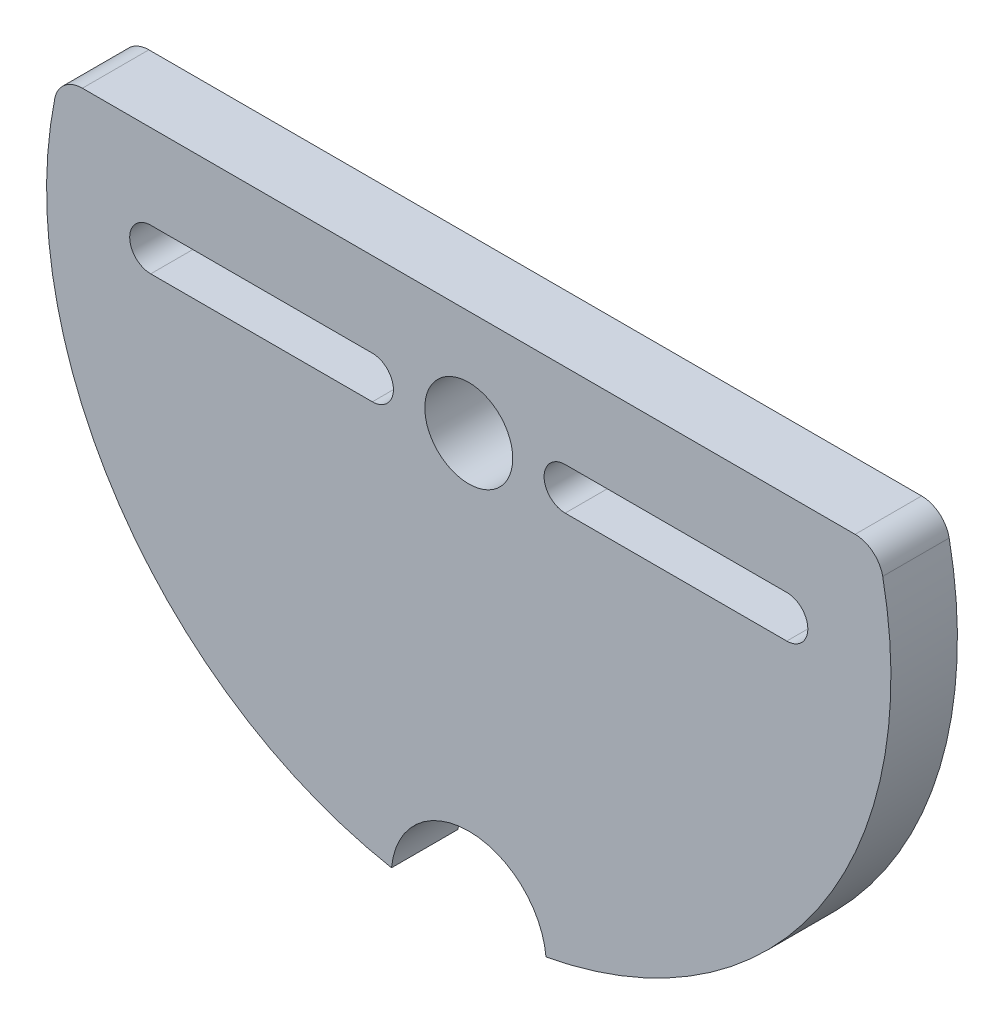
ISO-10303-21;
HEADER;
FILE_DESCRIPTION(('STEP AP214'),'2;1');
FILE_NAME('part.step','',(''),(''),'','','');
FILE_SCHEMA(('AUTOMOTIVE_DESIGN { 1 0 10303 214 1 1 1 1 }'));
ENDSEC;
DATA;
#1=APPLICATION_CONTEXT('core data for automotive mechanical design processes');
#2=APPLICATION_PROTOCOL_DEFINITION('international standard','automotive_design',2000,#1);
#3=PRODUCT_CONTEXT('',#1,'mechanical');
#4=PRODUCT('Part','Part','',(#3));
#5=PRODUCT_RELATED_PRODUCT_CATEGORY('part','',(#4));
#6=PRODUCT_DEFINITION_FORMATION('','',#4);
#7=PRODUCT_DEFINITION_CONTEXT('part definition',#1,'design');
#8=PRODUCT_DEFINITION('design','',#6,#7);
#9=PRODUCT_DEFINITION_SHAPE('','',#8);
#10=(LENGTH_UNIT() NAMED_UNIT(*) SI_UNIT(.MILLI.,.METRE.));
#11=(NAMED_UNIT(*) PLANE_ANGLE_UNIT() SI_UNIT($,.RADIAN.));
#12=(NAMED_UNIT(*) SI_UNIT($,.STERADIAN.) SOLID_ANGLE_UNIT());
#13=UNCERTAINTY_MEASURE_WITH_UNIT(LENGTH_MEASURE(1.E-05),#10,'distance_accuracy_value','');
#14=(GEOMETRIC_REPRESENTATION_CONTEXT(3) GLOBAL_UNCERTAINTY_ASSIGNED_CONTEXT((#13)) GLOBAL_UNIT_ASSIGNED_CONTEXT((#10,
#11,#12)) REPRESENTATION_CONTEXT('',''));
#15=CARTESIAN_POINT('',(0.,0.,0.));
#16=DIRECTION('',(0.,0.,1.));
#17=DIRECTION('',(1.,0.,0.));
#18=AXIS2_PLACEMENT_3D('',#15,#16,#17);
#19=CARTESIAN_POINT('',(0.,-19.05,3.));
#20=DIRECTION('',(0.,0.,-1.));
#21=DIRECTION('',(-1.,0.,0.));
#22=AXIS2_PLACEMENT_3D('',#19,#20,#21);
#23=CYLINDRICAL_SURFACE('',#22,3.5);
#24=CARTESIAN_POINT('',(0.,-19.05,0.));
#25=DIRECTION('',(0.,0.,-1.));
#26=DIRECTION('',(-1.,0.,0.));
#27=AXIS2_PLACEMENT_3D('',#24,#25,#26);
#28=CIRCLE('',#27,3.5);
#29=CARTESIAN_POINT('',(-3.48520062612727,-18.7284776902887,0.));
#30=VERTEX_POINT('',#29);
#31=CARTESIAN_POINT('',(3.48520062612727,-18.7284776902887,0.));
#32=VERTEX_POINT('',#31);
#33=EDGE_CURVE('E187',#30,#32,#28,.T.);
#34=ORIENTED_EDGE('',*,*,#33,.T.);
#35=DIRECTION('',(0.,0.,-1.));
#36=VECTOR('',#35,1.);
#37=CARTESIAN_POINT('',(3.48520062612727,-18.7284776902887,3.));
#38=LINE('',#37,#36);
#39=CARTESIAN_POINT('',(3.48520062612727,-18.7284776902887,3.));
#40=VERTEX_POINT('',#39);
#41=EDGE_CURVE('E11',#40,#32,#38,.T.);
#42=ORIENTED_EDGE('',*,*,#41,.F.);
#43=CARTESIAN_POINT('',(0.,-19.05,3.));
#44=DIRECTION('',(0.,0.,-1.));
#45=DIRECTION('',(-1.,0.,0.));
#46=AXIS2_PLACEMENT_3D('',#43,#44,#45);
#47=CIRCLE('',#46,3.5);
#48=CARTESIAN_POINT('',(-3.48520062612727,-18.7284776902887,3.));
#49=VERTEX_POINT('',#48);
#50=EDGE_CURVE('E242',#49,#40,#47,.T.);
#51=ORIENTED_EDGE('',*,*,#50,.F.);
#52=DIRECTION('',(0.,0.,-1.));
#53=VECTOR('',#52,1.);
#54=CARTESIAN_POINT('',(-3.48520062612727,-18.7284776902887,3.));
#55=LINE('',#54,#53);
#56=EDGE_CURVE('E262',#49,#30,#55,.T.);
#57=ORIENTED_EDGE('',*,*,#56,.T.);
#58=EDGE_LOOP('',(#34,#42,#51,#57));
#59=FACE_BOUND('',#58,.T.);
#60=ADVANCED_FACE('F39',(#59),#23,.F.);
#61=CARTESIAN_POINT('',(0.,0.,3.));
#62=DIRECTION('',(0.,0.,-1.));
#63=DIRECTION('',(-1.,0.,0.));
#64=AXIS2_PLACEMENT_3D('',#61,#62,#63);
#65=CYLINDRICAL_SURFACE('',#64,19.05);
#66=CARTESIAN_POINT('',(0.,0.,0.));
#67=DIRECTION('',(0.,0.,1.));
#68=DIRECTION('',(-1.,0.,0.));
#69=AXIS2_PLACEMENT_3D('',#66,#67,#68);
#70=CIRCLE('',#69,19.05);
#71=CARTESIAN_POINT('',(18.6788705034442,3.74196428571429,0.));
#72=VERTEX_POINT('',#71);
#73=EDGE_CURVE('E266',#32,#72,#70,.T.);
#74=ORIENTED_EDGE('',*,*,#73,.T.);
#75=DIRECTION('',(0.,0.,-1.));
#76=VECTOR('',#75,1.);
#77=CARTESIAN_POINT('',(18.6788705034442,3.74196428571429,3.));
#78=LINE('',#77,#76);
#79=CARTESIAN_POINT('',(18.6788705034442,3.74196428571429,3.));
#80=VERTEX_POINT('',#79);
#81=EDGE_CURVE('E47',#80,#72,#78,.T.);
#82=ORIENTED_EDGE('',*,*,#81,.F.);
#83=CARTESIAN_POINT('',(0.,0.,3.));
#84=DIRECTION('',(0.,0.,1.));
#85=DIRECTION('',(-1.,0.,0.));
#86=AXIS2_PLACEMENT_3D('',#83,#84,#85);
#87=CIRCLE('',#86,19.05);
#88=EDGE_CURVE('E246',#40,#80,#87,.T.);
#89=ORIENTED_EDGE('',*,*,#88,.F.);
#90=ORIENTED_EDGE('',*,*,#41,.T.);
#91=EDGE_LOOP('',(#74,#82,#89,#90));
#92=FACE_BOUND('',#91,.T.);
#93=ADVANCED_FACE('F322',(#92),#65,.T.);
#94=CARTESIAN_POINT('',(17.4336124698813,3.4925,3.));
#95=DIRECTION('',(0.,0.,-1.));
#96=DIRECTION('',(-1.,0.,0.));
#97=AXIS2_PLACEMENT_3D('',#94,#95,#96);
#98=CYLINDRICAL_SURFACE('',#97,1.27);
#99=CARTESIAN_POINT('',(17.4336124698813,3.4925,0.));
#100=DIRECTION('',(0.,0.,1.));
#101=DIRECTION('',(-1.,0.,0.));
#102=AXIS2_PLACEMENT_3D('',#99,#100,#101);
#103=CIRCLE('',#102,1.27);
#104=CARTESIAN_POINT('',(17.4336124698813,4.7625,0.));
#105=VERTEX_POINT('',#104);
#106=EDGE_CURVE('E269',#72,#105,#103,.T.);
#107=ORIENTED_EDGE('',*,*,#106,.T.);
#108=DIRECTION('',(0.,0.,-1.));
#109=VECTOR('',#108,1.);
#110=CARTESIAN_POINT('',(17.4336124698813,4.7625,3.));
#111=LINE('',#110,#109);
#112=CARTESIAN_POINT('',(17.4336124698813,4.7625,3.));
#113=VERTEX_POINT('',#112);
#114=EDGE_CURVE('E291',#113,#105,#111,.T.);
#115=ORIENTED_EDGE('',*,*,#114,.F.);
#116=CARTESIAN_POINT('',(17.4336124698813,3.4925,3.));
#117=DIRECTION('',(0.,0.,1.));
#118=DIRECTION('',(-1.,0.,0.));
#119=AXIS2_PLACEMENT_3D('',#116,#117,#118);
#120=CIRCLE('',#119,1.27);
#121=EDGE_CURVE('E250',#80,#113,#120,.T.);
#122=ORIENTED_EDGE('',*,*,#121,.F.);
#123=ORIENTED_EDGE('',*,*,#81,.T.);
#124=EDGE_LOOP('',(#107,#115,#122,#123));
#125=FACE_BOUND('',#124,.T.);
#126=ADVANCED_FACE('F300',(#125),#98,.T.);
#127=CARTESIAN_POINT('',(17.4336124698813,4.7625,3.));
#128=DIRECTION('',(0.,-1.,0.));
#129=DIRECTION('',(1.,0.,0.));
#130=AXIS2_PLACEMENT_3D('',#127,#128,#129);
#131=PLANE('',#130);
#132=DIRECTION('',(-1.,0.,0.));
#133=VECTOR('',#132,1.);
#134=CARTESIAN_POINT('',(17.4336124698813,4.7625,0.));
#135=LINE('',#134,#133);
#136=CARTESIAN_POINT('',(-17.4336124698813,4.7625,0.));
#137=VERTEX_POINT('',#136);
#138=EDGE_CURVE('E272',#105,#137,#135,.T.);
#139=ORIENTED_EDGE('',*,*,#138,.T.);
#140=DIRECTION('',(0.,0.,-1.));
#141=VECTOR('',#140,1.);
#142=CARTESIAN_POINT('',(-17.4336124698813,4.7625,3.));
#143=LINE('',#142,#141);
#144=CARTESIAN_POINT('',(-17.4336124698813,4.7625,3.));
#145=VERTEX_POINT('',#144);
#146=EDGE_CURVE('E287',#145,#137,#143,.T.);
#147=ORIENTED_EDGE('',*,*,#146,.F.);
#148=DIRECTION('',(-1.,0.,0.));
#149=VECTOR('',#148,1.);
#150=CARTESIAN_POINT('',(17.4336124698813,4.7625,3.));
#151=LINE('',#150,#149);
#152=EDGE_CURVE('E253',#113,#145,#151,.T.);
#153=ORIENTED_EDGE('',*,*,#152,.F.);
#154=ORIENTED_EDGE('',*,*,#114,.T.);
#155=EDGE_LOOP('',(#139,#147,#153,#154));
#156=FACE_BOUND('',#155,.T.);
#157=ADVANCED_FACE('F310',(#156),#131,.F.);
#158=CARTESIAN_POINT('',(-17.4336124698813,3.4925,3.));
#159=DIRECTION('',(0.,0.,-1.));
#160=DIRECTION('',(-1.,0.,0.));
#161=AXIS2_PLACEMENT_3D('',#158,#159,#160);
#162=CYLINDRICAL_SURFACE('',#161,1.27);
#163=CARTESIAN_POINT('',(-17.4336124698813,3.4925,0.));
#164=DIRECTION('',(0.,0.,1.));
#165=DIRECTION('',(1.,0.,0.));
#166=AXIS2_PLACEMENT_3D('',#163,#164,#165);
#167=CIRCLE('',#166,1.27);
#168=CARTESIAN_POINT('',(-18.6788705034442,3.74196428571428,0.));
#169=VERTEX_POINT('',#168);
#170=EDGE_CURVE('E275',#137,#169,#167,.T.);
#171=ORIENTED_EDGE('',*,*,#170,.T.);
#172=DIRECTION('',(0.,0.,-1.));
#173=VECTOR('',#172,1.);
#174=CARTESIAN_POINT('',(-18.6788705034442,3.74196428571428,3.));
#175=LINE('',#174,#173);
#176=CARTESIAN_POINT('',(-18.6788705034442,3.74196428571428,3.));
#177=VERTEX_POINT('',#176);
#178=EDGE_CURVE('E283',#177,#169,#175,.T.);
#179=ORIENTED_EDGE('',*,*,#178,.F.);
#180=CARTESIAN_POINT('',(-17.4336124698813,3.4925,3.));
#181=DIRECTION('',(0.,0.,1.));
#182=DIRECTION('',(1.,0.,0.));
#183=AXIS2_PLACEMENT_3D('',#180,#181,#182);
#184=CIRCLE('',#183,1.27);
#185=EDGE_CURVE('E256',#145,#177,#184,.T.);
#186=ORIENTED_EDGE('',*,*,#185,.F.);
#187=ORIENTED_EDGE('',*,*,#146,.T.);
#188=EDGE_LOOP('',(#171,#179,#186,#187));
#189=FACE_BOUND('',#188,.T.);
#190=ADVANCED_FACE('F314',(#189),#162,.T.);
#191=CARTESIAN_POINT('',(0.,0.,3.));
#192=DIRECTION('',(0.,0.,-1.));
#193=DIRECTION('',(-1.,0.,0.));
#194=AXIS2_PLACEMENT_3D('',#191,#192,#193);
#195=CYLINDRICAL_SURFACE('',#194,19.05);
#196=CARTESIAN_POINT('',(0.,0.,0.));
#197=DIRECTION('',(0.,0.,1.));
#198=DIRECTION('',(1.,0.,0.));
#199=AXIS2_PLACEMENT_3D('',#196,#197,#198);
#200=CIRCLE('',#199,19.05);
#201=EDGE_CURVE('E247',#169,#30,#200,.T.);
#202=ORIENTED_EDGE('',*,*,#201,.T.);
#203=ORIENTED_EDGE('',*,*,#56,.F.);
#204=CARTESIAN_POINT('',(0.,0.,3.));
#205=DIRECTION('',(0.,0.,1.));
#206=DIRECTION('',(1.,0.,0.));
#207=AXIS2_PLACEMENT_3D('',#204,#205,#206);
#208=CIRCLE('',#207,19.05);
#209=EDGE_CURVE('E259',#177,#49,#208,.T.);
#210=ORIENTED_EDGE('',*,*,#209,.F.);
#211=ORIENTED_EDGE('',*,*,#178,.T.);
#212=EDGE_LOOP('',(#202,#203,#210,#211));
#213=FACE_BOUND('',#212,.T.);
#214=ADVANCED_FACE('F325',(#213),#195,.T.);
#215=CARTESIAN_POINT('',(0.,-19.05,3.));
#216=DIRECTION('',(0.,0.,-1.));
#217=DIRECTION('',(-1.,0.,0.));
#218=AXIS2_PLACEMENT_3D('',#215,#216,#217);
#219=PLANE('',#218);
#220=DIRECTION('',(1.,0.,0.));
#221=VECTOR('',#220,1.);
#222=CARTESIAN_POINT('',(-14.350000002,-0.95,3.));
#223=LINE('',#222,#221);
#224=CARTESIAN_POINT('',(-14.350000002,-0.949999999999999,3.));
#225=VERTEX_POINT('',#224);
#226=CARTESIAN_POINT('',(-4.35,-0.95,3.));
#227=VERTEX_POINT('',#226);
#228=EDGE_CURVE('E177',#225,#227,#223,.T.);
#229=ORIENTED_EDGE('',*,*,#228,.F.);
#230=CARTESIAN_POINT('',(-14.350000002,0.,3.));
#231=DIRECTION('',(0.,0.,1.));
#232=DIRECTION('',(1.,0.,0.));
#233=AXIS2_PLACEMENT_3D('',#230,#231,#232);
#234=CIRCLE('',#233,0.95);
#235=CARTESIAN_POINT('',(-14.350000002,0.95,3.));
#236=VERTEX_POINT('',#235);
#237=EDGE_CURVE('E54',#236,#225,#234,.T.);
#238=ORIENTED_EDGE('',*,*,#237,.F.);
#239=DIRECTION('',(-1.,0.,0.));
#240=VECTOR('',#239,1.);
#241=CARTESIAN_POINT('',(-14.350000002,0.95,3.));
#242=LINE('',#241,#240);
#243=CARTESIAN_POINT('',(-4.35,0.95,3.));
#244=VERTEX_POINT('',#243);
#245=EDGE_CURVE('E164',#244,#236,#242,.T.);
#246=ORIENTED_EDGE('',*,*,#245,.F.);
#247=CARTESIAN_POINT('',(-4.35,0.,3.));
#248=DIRECTION('',(0.,0.,1.));
#249=DIRECTION('',(1.,0.,0.));
#250=AXIS2_PLACEMENT_3D('',#247,#248,#249);
#251=CIRCLE('',#250,0.95);
#252=EDGE_CURVE('E168',#227,#244,#251,.T.);
#253=ORIENTED_EDGE('',*,*,#252,.F.);
#254=EDGE_LOOP('',(#229,#238,#246,#253));
#255=FACE_BOUND('',#254,.T.);
#256=DIRECTION('',(1.,0.,0.));
#257=VECTOR('',#256,1.);
#258=CARTESIAN_POINT('',(4.35,-0.95,3.));
#259=LINE('',#258,#257);
#260=CARTESIAN_POINT('',(4.35,-0.950000000000001,3.));
#261=VERTEX_POINT('',#260);
#262=CARTESIAN_POINT('',(14.350000002,-0.950000000000001,3.));
#263=VERTEX_POINT('',#262);
#264=EDGE_CURVE('E213',#261,#263,#259,.T.);
#265=ORIENTED_EDGE('',*,*,#264,.F.);
#266=CARTESIAN_POINT('',(4.35,0.,3.));
#267=DIRECTION('',(0.,0.,1.));
#268=DIRECTION('',(1.,0.,0.));
#269=AXIS2_PLACEMENT_3D('',#266,#267,#268);
#270=CIRCLE('',#269,0.95);
#271=CARTESIAN_POINT('',(4.35,0.95,3.));
#272=VERTEX_POINT('',#271);
#273=EDGE_CURVE('E62',#272,#261,#270,.T.);
#274=ORIENTED_EDGE('',*,*,#273,.F.);
#275=DIRECTION('',(-1.,0.,0.));
#276=VECTOR('',#275,1.);
#277=CARTESIAN_POINT('',(4.35,0.95,3.));
#278=LINE('',#277,#276);
#279=CARTESIAN_POINT('',(14.350000002,0.950000000000005,3.));
#280=VERTEX_POINT('',#279);
#281=EDGE_CURVE('E198',#280,#272,#278,.T.);
#282=ORIENTED_EDGE('',*,*,#281,.F.);
#283=CARTESIAN_POINT('',(14.350000002,0.,3.));
#284=DIRECTION('',(0.,0.,1.));
#285=DIRECTION('',(1.,0.,0.));
#286=AXIS2_PLACEMENT_3D('',#283,#284,#285);
#287=CIRCLE('',#286,0.95);
#288=EDGE_CURVE('E218',#263,#280,#287,.T.);
#289=ORIENTED_EDGE('',*,*,#288,.F.);
#290=EDGE_LOOP('',(#265,#274,#282,#289));
#291=FACE_BOUND('',#290,.T.);
#292=CARTESIAN_POINT('',(0.,0.,3.));
#293=DIRECTION('',(0.,0.,1.));
#294=DIRECTION('',(1.,0.,0.));
#295=AXIS2_PLACEMENT_3D('',#292,#293,#294);
#296=CIRCLE('',#295,1.984375);
#297=CARTESIAN_POINT('',(1.984375,0.,3.));
#298=VERTEX_POINT('',#297);
#299=EDGE_CURVE('E238',#298,#298,#296,.T.);
#300=ORIENTED_EDGE('',*,*,#299,.F.);
#301=EDGE_LOOP('',(#300));
#302=FACE_BOUND('',#301,.T.);
#303=ORIENTED_EDGE('',*,*,#50,.T.);
#304=ORIENTED_EDGE('',*,*,#88,.T.);
#305=ORIENTED_EDGE('',*,*,#121,.T.);
#306=ORIENTED_EDGE('',*,*,#152,.T.);
#307=ORIENTED_EDGE('',*,*,#185,.T.);
#308=ORIENTED_EDGE('',*,*,#209,.T.);
#309=EDGE_LOOP('',(#303,#304,#305,#306,#307,#308));
#310=FACE_BOUND('',#309,.T.);
#311=ADVANCED_FACE('F318',(#255,#291,#302,#310),#219,.F.);
#312=CARTESIAN_POINT('',(0.,-19.05,0.));
#313=DIRECTION('',(0.,0.,-1.));
#314=DIRECTION('',(-1.,0.,0.));
#315=AXIS2_PLACEMENT_3D('',#312,#313,#314);
#316=PLANE('',#315);
#317=CARTESIAN_POINT('',(-14.350000002,0.,0.));
#318=DIRECTION('',(0.,0.,1.));
#319=DIRECTION('',(1.,0.,0.));
#320=AXIS2_PLACEMENT_3D('',#317,#318,#319);
#321=CIRCLE('',#320,0.95);
#322=CARTESIAN_POINT('',(-14.350000002,0.95,0.));
#323=VERTEX_POINT('',#322);
#324=CARTESIAN_POINT('',(-14.350000002,-0.95,0.));
#325=VERTEX_POINT('',#324);
#326=EDGE_CURVE('E142',#323,#325,#321,.T.);
#327=ORIENTED_EDGE('',*,*,#326,.T.);
#328=DIRECTION('',(1.,0.,0.));
#329=VECTOR('',#328,1.);
#330=CARTESIAN_POINT('',(-14.350000002,-0.95,0.));
#331=LINE('',#330,#329);
#332=CARTESIAN_POINT('',(-4.35,-0.95,0.));
#333=VERTEX_POINT('',#332);
#334=EDGE_CURVE('E153',#325,#333,#331,.T.);
#335=ORIENTED_EDGE('',*,*,#334,.T.);
#336=CARTESIAN_POINT('',(-4.35,0.,0.));
#337=DIRECTION('',(0.,0.,1.));
#338=DIRECTION('',(1.,0.,0.));
#339=AXIS2_PLACEMENT_3D('',#336,#337,#338);
#340=CIRCLE('',#339,0.95);
#341=CARTESIAN_POINT('',(-4.35,0.95,0.));
#342=VERTEX_POINT('',#341);
#343=EDGE_CURVE('E158',#333,#342,#340,.T.);
#344=ORIENTED_EDGE('',*,*,#343,.T.);
#345=DIRECTION('',(-1.,0.,0.));
#346=VECTOR('',#345,1.);
#347=CARTESIAN_POINT('',(-14.350000002,0.95,0.));
#348=LINE('',#347,#346);
#349=EDGE_CURVE('E149',#342,#323,#348,.T.);
#350=ORIENTED_EDGE('',*,*,#349,.T.);
#351=EDGE_LOOP('',(#327,#335,#344,#350));
#352=FACE_BOUND('',#351,.T.);
#353=CARTESIAN_POINT('',(4.35,0.,0.));
#354=DIRECTION('',(0.,0.,1.));
#355=DIRECTION('',(1.,0.,0.));
#356=AXIS2_PLACEMENT_3D('',#353,#354,#355);
#357=CIRCLE('',#356,0.95);
#358=CARTESIAN_POINT('',(4.35,0.95,0.));
#359=VERTEX_POINT('',#358);
#360=CARTESIAN_POINT('',(4.35,-0.95,0.));
#361=VERTEX_POINT('',#360);
#362=EDGE_CURVE('E193',#359,#361,#357,.T.);
#363=ORIENTED_EDGE('',*,*,#362,.T.);
#364=DIRECTION('',(1.,0.,0.));
#365=VECTOR('',#364,1.);
#366=CARTESIAN_POINT('',(4.35,-0.95,0.));
#367=LINE('',#366,#365);
#368=CARTESIAN_POINT('',(14.350000002,-0.949999999999995,0.));
#369=VERTEX_POINT('',#368);
#370=EDGE_CURVE('E197',#361,#369,#367,.T.);
#371=ORIENTED_EDGE('',*,*,#370,.T.);
#372=CARTESIAN_POINT('',(14.350000002,0.,0.));
#373=DIRECTION('',(0.,0.,1.));
#374=DIRECTION('',(1.,0.,0.));
#375=AXIS2_PLACEMENT_3D('',#372,#373,#374);
#376=CIRCLE('',#375,0.95);
#377=CARTESIAN_POINT('',(14.350000002,0.950000000000005,0.));
#378=VERTEX_POINT('',#377);
#379=EDGE_CURVE('E202',#369,#378,#376,.T.);
#380=ORIENTED_EDGE('',*,*,#379,.T.);
#381=DIRECTION('',(-1.,0.,0.));
#382=VECTOR('',#381,1.);
#383=CARTESIAN_POINT('',(4.35,0.95,0.));
#384=LINE('',#383,#382);
#385=EDGE_CURVE('E206',#378,#359,#384,.T.);
#386=ORIENTED_EDGE('',*,*,#385,.T.);
#387=EDGE_LOOP('',(#363,#371,#380,#386));
#388=FACE_BOUND('',#387,.T.);
#389=CARTESIAN_POINT('',(0.,0.,0.));
#390=DIRECTION('',(0.,0.,1.));
#391=DIRECTION('',(1.,0.,0.));
#392=AXIS2_PLACEMENT_3D('',#389,#390,#391);
#393=CIRCLE('',#392,1.984375);
#394=CARTESIAN_POINT('',(1.984375,0.,0.));
#395=VERTEX_POINT('',#394);
#396=EDGE_CURVE('E214',#395,#395,#393,.T.);
#397=ORIENTED_EDGE('',*,*,#396,.T.);
#398=EDGE_LOOP('',(#397));
#399=FACE_BOUND('',#398,.T.);
#400=ORIENTED_EDGE('',*,*,#33,.F.);
#401=ORIENTED_EDGE('',*,*,#201,.F.);
#402=ORIENTED_EDGE('',*,*,#170,.F.);
#403=ORIENTED_EDGE('',*,*,#138,.F.);
#404=ORIENTED_EDGE('',*,*,#106,.F.);
#405=ORIENTED_EDGE('',*,*,#73,.F.);
#406=EDGE_LOOP('',(#400,#401,#402,#403,#404,#405));
#407=FACE_BOUND('',#406,.T.);
#408=ADVANCED_FACE('F160',(#352,#388,#399,#407),#316,.T.);
#409=CARTESIAN_POINT('',(0.,0.,0.));
#410=DIRECTION('',(0.,0.,1.));
#411=DIRECTION('',(1.,0.,0.));
#412=AXIS2_PLACEMENT_3D('',#409,#410,#411);
#413=CYLINDRICAL_SURFACE('',#412,1.984375);
#414=ORIENTED_EDGE('',*,*,#396,.F.);
#415=EDGE_LOOP('',(#414));
#416=FACE_BOUND('',#415,.T.);
#417=ORIENTED_EDGE('',*,*,#299,.T.);
#418=EDGE_LOOP('',(#417));
#419=FACE_BOUND('',#418,.T.);
#420=ADVANCED_FACE('F373',(#416,#419),#413,.F.);
#421=CARTESIAN_POINT('',(4.35,0.,0.));
#422=DIRECTION('',(0.,0.,1.));
#423=DIRECTION('',(1.,0.,0.));
#424=AXIS2_PLACEMENT_3D('',#421,#422,#423);
#425=CYLINDRICAL_SURFACE('',#424,0.95);
#426=ORIENTED_EDGE('',*,*,#273,.T.);
#427=DIRECTION('',(0.,0.,1.));
#428=VECTOR('',#427,1.);
#429=CARTESIAN_POINT('',(4.35,-0.95,0.));
#430=LINE('',#429,#428);
#431=EDGE_CURVE('E210',#361,#261,#430,.T.);
#432=ORIENTED_EDGE('',*,*,#431,.F.);
#433=ORIENTED_EDGE('',*,*,#362,.F.);
#434=DIRECTION('',(0.,0.,1.));
#435=VECTOR('',#434,1.);
#436=CARTESIAN_POINT('',(4.35,0.95,0.));
#437=LINE('',#436,#435);
#438=EDGE_CURVE('E178',#359,#272,#437,.T.);
#439=ORIENTED_EDGE('',*,*,#438,.T.);
#440=EDGE_LOOP('',(#426,#432,#433,#439));
#441=FACE_BOUND('',#440,.T.);
#442=ADVANCED_FACE('F381',(#441),#425,.F.);
#443=CARTESIAN_POINT('',(4.35,0.95,0.));
#444=DIRECTION('',(0.,1.,0.));
#445=DIRECTION('',(-1.,0.,0.));
#446=AXIS2_PLACEMENT_3D('',#443,#444,#445);
#447=PLANE('',#446);
#448=ORIENTED_EDGE('',*,*,#281,.T.);
#449=ORIENTED_EDGE('',*,*,#438,.F.);
#450=ORIENTED_EDGE('',*,*,#385,.F.);
#451=DIRECTION('',(0.,0.,1.));
#452=VECTOR('',#451,1.);
#453=CARTESIAN_POINT('',(14.350000002,0.950000000000005,0.));
#454=LINE('',#453,#452);
#455=EDGE_CURVE('E227',#378,#280,#454,.T.);
#456=ORIENTED_EDGE('',*,*,#455,.T.);
#457=EDGE_LOOP('',(#448,#449,#450,#456));
#458=FACE_BOUND('',#457,.T.);
#459=ADVANCED_FACE('F391',(#458),#447,.F.);
#460=CARTESIAN_POINT('',(14.350000002,0.,0.));
#461=DIRECTION('',(0.,0.,1.));
#462=DIRECTION('',(1.,0.,0.));
#463=AXIS2_PLACEMENT_3D('',#460,#461,#462);
#464=CYLINDRICAL_SURFACE('',#463,0.95);
#465=ORIENTED_EDGE('',*,*,#288,.T.);
#466=ORIENTED_EDGE('',*,*,#455,.F.);
#467=ORIENTED_EDGE('',*,*,#379,.F.);
#468=DIRECTION('',(0.,0.,1.));
#469=VECTOR('',#468,1.);
#470=CARTESIAN_POINT('',(14.350000002,-0.950000000000001,0.));
#471=LINE('',#470,#469);
#472=EDGE_CURVE('E230',#369,#263,#471,.T.);
#473=ORIENTED_EDGE('',*,*,#472,.T.);
#474=EDGE_LOOP('',(#465,#466,#467,#473));
#475=FACE_BOUND('',#474,.T.);
#476=ADVANCED_FACE('F400',(#475),#464,.F.);
#477=CARTESIAN_POINT('',(4.35,-0.95,0.));
#478=DIRECTION('',(0.,-1.,0.));
#479=DIRECTION('',(1.,0.,0.));
#480=AXIS2_PLACEMENT_3D('',#477,#478,#479);
#481=PLANE('',#480);
#482=ORIENTED_EDGE('',*,*,#264,.T.);
#483=ORIENTED_EDGE('',*,*,#472,.F.);
#484=ORIENTED_EDGE('',*,*,#370,.F.);
#485=ORIENTED_EDGE('',*,*,#431,.T.);
#486=EDGE_LOOP('',(#482,#483,#484,#485));
#487=FACE_BOUND('',#486,.T.);
#488=ADVANCED_FACE('F410',(#487),#481,.F.);
#489=CARTESIAN_POINT('',(-14.350000002,0.,0.));
#490=DIRECTION('',(0.,0.,1.));
#491=DIRECTION('',(1.,0.,0.));
#492=AXIS2_PLACEMENT_3D('',#489,#490,#491);
#493=CYLINDRICAL_SURFACE('',#492,0.95);
#494=ORIENTED_EDGE('',*,*,#237,.T.);
#495=DIRECTION('',(0.,0.,1.));
#496=VECTOR('',#495,1.);
#497=CARTESIAN_POINT('',(-14.350000002,-0.95,0.));
#498=LINE('',#497,#496);
#499=EDGE_CURVE('E138',#325,#225,#498,.T.);
#500=ORIENTED_EDGE('',*,*,#499,.F.);
#501=ORIENTED_EDGE('',*,*,#326,.F.);
#502=DIRECTION('',(0.,0.,1.));
#503=VECTOR('',#502,1.);
#504=CARTESIAN_POINT('',(-14.350000002,0.95,0.));
#505=LINE('',#504,#503);
#506=EDGE_CURVE('E184',#323,#236,#505,.T.);
#507=ORIENTED_EDGE('',*,*,#506,.T.);
#508=EDGE_LOOP('',(#494,#500,#501,#507));
#509=FACE_BOUND('',#508,.T.);
#510=ADVANCED_FACE('F140',(#509),#493,.F.);
#511=CARTESIAN_POINT('',(-14.350000002,0.95,0.));
#512=DIRECTION('',(0.,1.,0.));
#513=DIRECTION('',(-1.,0.,0.));
#514=AXIS2_PLACEMENT_3D('',#511,#512,#513);
#515=PLANE('',#514);
#516=ORIENTED_EDGE('',*,*,#245,.T.);
#517=ORIENTED_EDGE('',*,*,#506,.F.);
#518=ORIENTED_EDGE('',*,*,#349,.F.);
#519=DIRECTION('',(0.,0.,1.));
#520=VECTOR('',#519,1.);
#521=CARTESIAN_POINT('',(-4.35,0.95,0.));
#522=LINE('',#521,#520);
#523=EDGE_CURVE('E188',#342,#244,#522,.T.);
#524=ORIENTED_EDGE('',*,*,#523,.T.);
#525=EDGE_LOOP('',(#516,#517,#518,#524));
#526=FACE_BOUND('',#525,.T.);
#527=ADVANCED_FACE('F429',(#526),#515,.F.);
#528=CARTESIAN_POINT('',(-4.35,0.,0.));
#529=DIRECTION('',(0.,0.,1.));
#530=DIRECTION('',(1.,0.,0.));
#531=AXIS2_PLACEMENT_3D('',#528,#529,#530);
#532=CYLINDRICAL_SURFACE('',#531,0.95);
#533=ORIENTED_EDGE('',*,*,#252,.T.);
#534=ORIENTED_EDGE('',*,*,#523,.F.);
#535=ORIENTED_EDGE('',*,*,#343,.F.);
#536=DIRECTION('',(0.,0.,1.));
#537=VECTOR('',#536,1.);
#538=CARTESIAN_POINT('',(-4.35,-0.95,0.));
#539=LINE('',#538,#537);
#540=EDGE_CURVE('E148',#333,#227,#539,.T.);
#541=ORIENTED_EDGE('',*,*,#540,.T.);
#542=EDGE_LOOP('',(#533,#534,#535,#541));
#543=FACE_BOUND('',#542,.T.);
#544=ADVANCED_FACE('F438',(#543),#532,.F.);
#545=CARTESIAN_POINT('',(-14.350000002,-0.95,0.));
#546=DIRECTION('',(0.,-1.,0.));
#547=DIRECTION('',(1.,0.,0.));
#548=AXIS2_PLACEMENT_3D('',#545,#546,#547);
#549=PLANE('',#548);
#550=ORIENTED_EDGE('',*,*,#228,.T.);
#551=ORIENTED_EDGE('',*,*,#540,.F.);
#552=ORIENTED_EDGE('',*,*,#334,.F.);
#553=ORIENTED_EDGE('',*,*,#499,.T.);
#554=EDGE_LOOP('',(#550,#551,#552,#553));
#555=FACE_BOUND('',#554,.T.);
#556=ADVANCED_FACE('F154',(#555),#549,.F.);
#557=CLOSED_SHELL('',(#60,#93,#126,#157,#190,#214,#311,#408,#420,#442,#459,#476,#488,#510,#527,
#544,#556));
#558=MANIFOLD_SOLID_BREP('B2',#557);
#559=ADVANCED_BREP_SHAPE_REPRESENTATION('',(#18,#558),#14);
#560=SHAPE_DEFINITION_REPRESENTATION(#9,#559);
ENDSEC;
END-ISO-10303-21;
